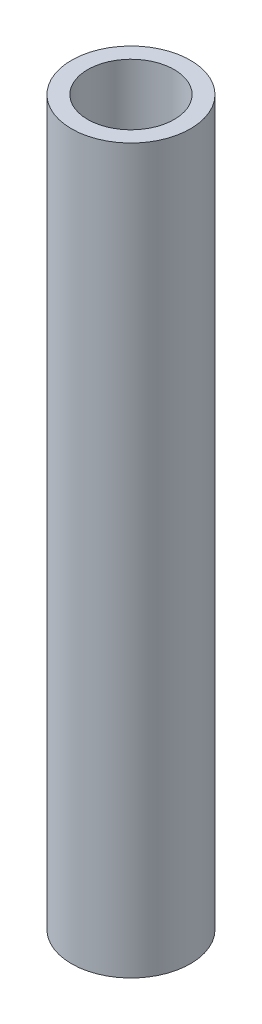
ISO-10303-21;
HEADER;
FILE_DESCRIPTION(('STEP AP214'),'2;1');
FILE_NAME('part.step','',(''),(''),'','','');
FILE_SCHEMA(('AUTOMOTIVE_DESIGN { 1 0 10303 214 1 1 1 1 }'));
ENDSEC;
DATA;
#1=APPLICATION_CONTEXT('core data for automotive mechanical design processes');
#2=APPLICATION_PROTOCOL_DEFINITION('international standard','automotive_design',2000,#1);
#3=PRODUCT_CONTEXT('',#1,'mechanical');
#4=PRODUCT('Part','Part','',(#3));
#5=PRODUCT_RELATED_PRODUCT_CATEGORY('part','',(#4));
#6=PRODUCT_DEFINITION_FORMATION('','',#4);
#7=PRODUCT_DEFINITION_CONTEXT('part definition',#1,'design');
#8=PRODUCT_DEFINITION('design','',#6,#7);
#9=PRODUCT_DEFINITION_SHAPE('','',#8);
#10=(LENGTH_UNIT() NAMED_UNIT(*) SI_UNIT(.MILLI.,.METRE.));
#11=(NAMED_UNIT(*) PLANE_ANGLE_UNIT() SI_UNIT($,.RADIAN.));
#12=(NAMED_UNIT(*) SI_UNIT($,.STERADIAN.) SOLID_ANGLE_UNIT());
#13=UNCERTAINTY_MEASURE_WITH_UNIT(LENGTH_MEASURE(1.E-05),#10,'distance_accuracy_value','');
#14=(GEOMETRIC_REPRESENTATION_CONTEXT(3) GLOBAL_UNCERTAINTY_ASSIGNED_CONTEXT((#13)) GLOBAL_UNIT_ASSIGNED_CONTEXT((#10,
#11,#12)) REPRESENTATION_CONTEXT('',''));
#15=CARTESIAN_POINT('',(0.,0.,0.));
#16=DIRECTION('',(0.,0.,1.));
#17=DIRECTION('',(1.,0.,0.));
#18=AXIS2_PLACEMENT_3D('',#15,#16,#17);
#19=CARTESIAN_POINT('',(0.,101.6,0.));
#20=DIRECTION('',(0.,1.,0.));
#21=DIRECTION('',(0.,0.,1.));
#22=AXIS2_PLACEMENT_3D('',#19,#20,#21);
#23=PLANE('',#22);
#24=CARTESIAN_POINT('',(0.,101.6,0.));
#25=DIRECTION('',(0.,1.,0.));
#26=DIRECTION('',(0.,0.,1.));
#27=AXIS2_PLACEMENT_3D('',#24,#25,#26);
#28=CIRCLE('',#27,16.7005);
#29=CARTESIAN_POINT('',(0.,101.6,16.7005));
#30=VERTEX_POINT('',#29);
#31=EDGE_CURVE('E10',#30,#30,#28,.T.);
#32=ORIENTED_EDGE('',*,*,#31,.T.);
#33=EDGE_LOOP('',(#32));
#34=FACE_BOUND('',#33,.T.);
#35=CARTESIAN_POINT('',(0.,101.6,0.));
#36=DIRECTION('',(0.,1.,0.));
#37=DIRECTION('',(0.,0.,1.));
#38=AXIS2_PLACEMENT_3D('',#35,#36,#37);
#39=CIRCLE('',#38,12.1539);
#40=CARTESIAN_POINT('',(0.,101.6,12.1539));
#41=VERTEX_POINT('',#40);
#42=EDGE_CURVE('E42',#41,#41,#39,.T.);
#43=ORIENTED_EDGE('',*,*,#42,.F.);
#44=EDGE_LOOP('',(#43));
#45=FACE_BOUND('',#44,.T.);
#46=ADVANCED_FACE('F31',(#34,#45),#23,.T.);
#47=CARTESIAN_POINT('',(0.,-101.6,0.));
#48=DIRECTION('',(0.,1.,0.));
#49=DIRECTION('',(0.,0.,1.));
#50=AXIS2_PLACEMENT_3D('',#47,#48,#49);
#51=PLANE('',#50);
#52=CARTESIAN_POINT('',(0.,-101.6,0.));
#53=DIRECTION('',(0.,1.,0.));
#54=DIRECTION('',(0.,0.,1.));
#55=AXIS2_PLACEMENT_3D('',#52,#53,#54);
#56=CIRCLE('',#55,16.7005);
#57=CARTESIAN_POINT('',(0.,-101.6,16.7005));
#58=VERTEX_POINT('',#57);
#59=EDGE_CURVE('E35',#58,#58,#56,.T.);
#60=ORIENTED_EDGE('',*,*,#59,.F.);
#61=EDGE_LOOP('',(#60));
#62=FACE_BOUND('',#61,.T.);
#63=CARTESIAN_POINT('',(0.,-101.6,0.));
#64=DIRECTION('',(0.,1.,0.));
#65=DIRECTION('',(0.,0.,1.));
#66=AXIS2_PLACEMENT_3D('',#63,#64,#65);
#67=CIRCLE('',#66,12.1539);
#68=CARTESIAN_POINT('',(0.,-101.6,12.1539));
#69=VERTEX_POINT('',#68);
#70=EDGE_CURVE('E44',#69,#69,#67,.T.);
#71=ORIENTED_EDGE('',*,*,#70,.T.);
#72=EDGE_LOOP('',(#71));
#73=FACE_BOUND('',#72,.T.);
#74=ADVANCED_FACE('F54',(#62,#73),#51,.F.);
#75=CARTESIAN_POINT('',(0.,101.6,0.));
#76=DIRECTION('',(0.,-1.,0.));
#77=DIRECTION('',(0.,0.,-1.));
#78=AXIS2_PLACEMENT_3D('',#75,#76,#77);
#79=CYLINDRICAL_SURFACE('',#78,16.7005);
#80=ORIENTED_EDGE('',*,*,#31,.F.);
#81=EDGE_LOOP('',(#80));
#82=FACE_BOUND('',#81,.T.);
#83=ORIENTED_EDGE('',*,*,#59,.T.);
#84=EDGE_LOOP('',(#83));
#85=FACE_BOUND('',#84,.T.);
#86=ADVANCED_FACE('F33',(#82,#85),#79,.T.);
#87=CARTESIAN_POINT('',(0.,101.6,0.));
#88=DIRECTION('',(0.,-1.,0.));
#89=DIRECTION('',(0.,0.,-1.));
#90=AXIS2_PLACEMENT_3D('',#87,#88,#89);
#91=CYLINDRICAL_SURFACE('',#90,12.1539);
#92=ORIENTED_EDGE('',*,*,#42,.T.);
#93=EDGE_LOOP('',(#92));
#94=FACE_BOUND('',#93,.T.);
#95=ORIENTED_EDGE('',*,*,#70,.F.);
#96=EDGE_LOOP('',(#95));
#97=FACE_BOUND('',#96,.T.);
#98=ADVANCED_FACE('F50',(#94,#97),#91,.F.);
#99=CLOSED_SHELL('',(#46,#74,#86,#98));
#100=MANIFOLD_SOLID_BREP('B2',#99);
#101=ADVANCED_BREP_SHAPE_REPRESENTATION('',(#18,#100),#14);
#102=SHAPE_DEFINITION_REPRESENTATION(#9,#101);
ENDSEC;
END-ISO-10303-21;
